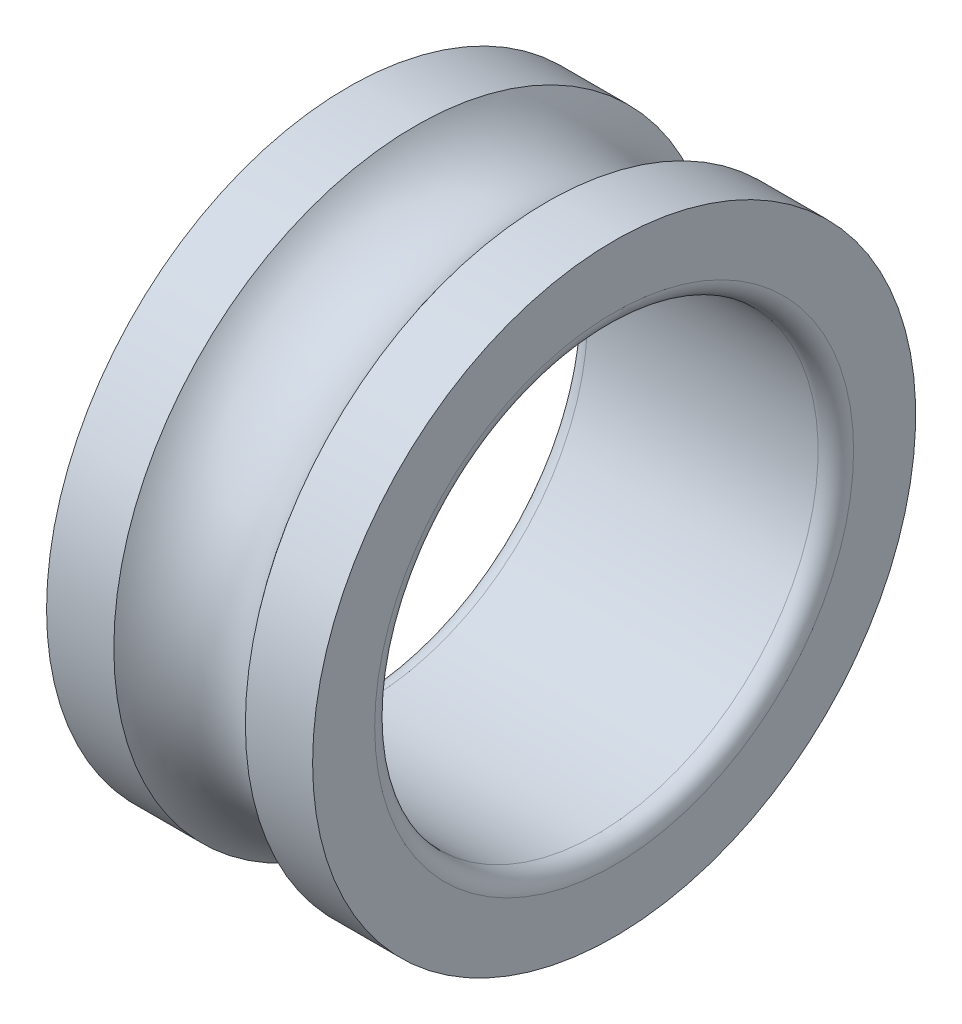
ISO-10303-21;
HEADER;
FILE_DESCRIPTION(('STEP AP214'),'2;1');
FILE_NAME('part.step','',(''),(''),'','','');
FILE_SCHEMA(('AUTOMOTIVE_DESIGN { 1 0 10303 214 1 1 1 1 }'));
ENDSEC;
DATA;
#1=APPLICATION_CONTEXT('core data for automotive mechanical design processes');
#2=APPLICATION_PROTOCOL_DEFINITION('international standard','automotive_design',2000,#1);
#3=PRODUCT_CONTEXT('',#1,'mechanical');
#4=PRODUCT('Part','Part','',(#3));
#5=PRODUCT_RELATED_PRODUCT_CATEGORY('part','',(#4));
#6=PRODUCT_DEFINITION_FORMATION('','',#4);
#7=PRODUCT_DEFINITION_CONTEXT('part definition',#1,'design');
#8=PRODUCT_DEFINITION('design','',#6,#7);
#9=PRODUCT_DEFINITION_SHAPE('','',#8);
#10=(LENGTH_UNIT() NAMED_UNIT(*) SI_UNIT(.MILLI.,.METRE.));
#11=(NAMED_UNIT(*) PLANE_ANGLE_UNIT() SI_UNIT($,.RADIAN.));
#12=(NAMED_UNIT(*) SI_UNIT($,.STERADIAN.) SOLID_ANGLE_UNIT());
#13=UNCERTAINTY_MEASURE_WITH_UNIT(LENGTH_MEASURE(1.E-05),#10,'distance_accuracy_value','');
#14=(GEOMETRIC_REPRESENTATION_CONTEXT(3) GLOBAL_UNCERTAINTY_ASSIGNED_CONTEXT((#13)) GLOBAL_UNIT_ASSIGNED_CONTEXT((#10,
#11,#12)) REPRESENTATION_CONTEXT('',''));
#15=CARTESIAN_POINT('',(0.,0.,0.));
#16=DIRECTION('',(0.,0.,1.));
#17=DIRECTION('',(1.,0.,0.));
#18=AXIS2_PLACEMENT_3D('',#15,#16,#17);
#19=CARTESIAN_POINT('',(0.,0.,0.));
#20=DIRECTION('',(-1.,0.,0.));
#21=DIRECTION('',(0.,0.,1.));
#22=AXIS2_PLACEMENT_3D('',#19,#20,#21);
#23=CYLINDRICAL_SURFACE('',#22,17.);
#24=CARTESIAN_POINT('',(0.,0.,0.));
#25=DIRECTION('',(-1.,0.,0.));
#26=DIRECTION('',(0.,0.,1.));
#27=AXIS2_PLACEMENT_3D('',#24,#25,#26);
#28=CIRCLE('',#27,17.);
#29=CARTESIAN_POINT('',(0.,0.,17.));
#30=VERTEX_POINT('',#29);
#31=EDGE_CURVE('E10',#30,#30,#28,.T.);
#32=ORIENTED_EDGE('',*,*,#31,.F.);
#33=EDGE_LOOP('',(#32));
#34=FACE_BOUND('',#33,.T.);
#35=CARTESIAN_POINT('',(3.79223787170752,0.,0.));
#36=DIRECTION('',(-1.,0.,0.));
#37=DIRECTION('',(0.,0.,1.));
#38=AXIS2_PLACEMENT_3D('',#35,#36,#37);
#39=CIRCLE('',#38,17.);
#40=CARTESIAN_POINT('',(3.79223787170752,0.,17.));
#41=VERTEX_POINT('',#40);
#42=EDGE_CURVE('E43',#41,#41,#39,.T.);
#43=ORIENTED_EDGE('',*,*,#42,.T.);
#44=EDGE_LOOP('',(#43));
#45=FACE_BOUND('',#44,.T.);
#46=ADVANCED_FACE('F15',(#34,#45),#23,.T.);
#47=CARTESIAN_POINT('',(0.,17.,0.));
#48=DIRECTION('',(1.,0.,0.));
#49=DIRECTION('',(0.,0.,-1.));
#50=AXIS2_PLACEMENT_3D('',#47,#48,#49);
#51=PLANE('',#50);
#52=CARTESIAN_POINT('',(0.,0.,0.));
#53=DIRECTION('',(-1.,0.,0.));
#54=DIRECTION('',(0.,0.,1.));
#55=AXIS2_PLACEMENT_3D('',#52,#53,#54);
#56=CIRCLE('',#55,13.5);
#57=CARTESIAN_POINT('',(0.,0.,13.5));
#58=VERTEX_POINT('',#57);
#59=EDGE_CURVE('E21',#58,#58,#56,.T.);
#60=ORIENTED_EDGE('',*,*,#59,.F.);
#61=EDGE_LOOP('',(#60));
#62=FACE_BOUND('',#61,.T.);
#63=ORIENTED_EDGE('',*,*,#31,.T.);
#64=EDGE_LOOP('',(#63));
#65=FACE_BOUND('',#64,.T.);
#66=ADVANCED_FACE('F61',(#62,#65),#51,.F.);
#67=CARTESIAN_POINT('',(1.,0.,0.));
#68=DIRECTION('',(-1.,0.,0.));
#69=DIRECTION('',(0.,0.,1.));
#70=AXIS2_PLACEMENT_3D('',#67,#68,#69);
#71=TOROIDAL_SURFACE('',#70,13.5,1.);
#72=CARTESIAN_POINT('',(1.,0.,0.));
#73=DIRECTION('',(-1.,0.,0.));
#74=DIRECTION('',(0.,0.,1.));
#75=AXIS2_PLACEMENT_3D('',#72,#73,#74);
#76=CIRCLE('',#75,12.5);
#77=CARTESIAN_POINT('',(1.,0.,12.5));
#78=VERTEX_POINT('',#77);
#79=EDGE_CURVE('E25',#78,#78,#76,.T.);
#80=ORIENTED_EDGE('',*,*,#79,.F.);
#81=EDGE_LOOP('',(#80));
#82=FACE_BOUND('',#81,.T.);
#83=ORIENTED_EDGE('',*,*,#59,.T.);
#84=EDGE_LOOP('',(#83));
#85=FACE_BOUND('',#84,.T.);
#86=ADVANCED_FACE('F66',(#82,#85),#71,.T.);
#87=CARTESIAN_POINT('',(0.,0.,0.));
#88=DIRECTION('',(-1.,0.,0.));
#89=DIRECTION('',(0.,0.,1.));
#90=AXIS2_PLACEMENT_3D('',#87,#88,#89);
#91=CYLINDRICAL_SURFACE('',#90,12.5);
#92=CARTESIAN_POINT('',(14.,0.,0.));
#93=DIRECTION('',(-1.,0.,0.));
#94=DIRECTION('',(0.,0.,1.));
#95=AXIS2_PLACEMENT_3D('',#92,#93,#94);
#96=CIRCLE('',#95,12.5);
#97=CARTESIAN_POINT('',(14.,0.,12.5));
#98=VERTEX_POINT('',#97);
#99=EDGE_CURVE('E29',#98,#98,#96,.T.);
#100=ORIENTED_EDGE('',*,*,#99,.F.);
#101=EDGE_LOOP('',(#100));
#102=FACE_BOUND('',#101,.T.);
#103=ORIENTED_EDGE('',*,*,#79,.T.);
#104=EDGE_LOOP('',(#103));
#105=FACE_BOUND('',#104,.T.);
#106=ADVANCED_FACE('F71',(#102,#105),#91,.F.);
#107=CARTESIAN_POINT('',(14.,0.,0.));
#108=DIRECTION('',(-1.,0.,0.));
#109=DIRECTION('',(0.,0.,1.));
#110=AXIS2_PLACEMENT_3D('',#107,#108,#109);
#111=TOROIDAL_SURFACE('',#110,13.5,1.);
#112=CARTESIAN_POINT('',(15.,0.,0.));
#113=DIRECTION('',(-1.,0.,0.));
#114=DIRECTION('',(0.,0.,1.));
#115=AXIS2_PLACEMENT_3D('',#112,#113,#114);
#116=CIRCLE('',#115,13.5);
#117=CARTESIAN_POINT('',(15.,0.,13.5));
#118=VERTEX_POINT('',#117);
#119=EDGE_CURVE('E34',#118,#118,#116,.T.);
#120=ORIENTED_EDGE('',*,*,#119,.F.);
#121=EDGE_LOOP('',(#120));
#122=FACE_BOUND('',#121,.T.);
#123=ORIENTED_EDGE('',*,*,#99,.T.);
#124=EDGE_LOOP('',(#123));
#125=FACE_BOUND('',#124,.T.);
#126=ADVANCED_FACE('F77',(#122,#125),#111,.T.);
#127=CARTESIAN_POINT('',(15.,13.5,0.));
#128=DIRECTION('',(-1.,0.,0.));
#129=DIRECTION('',(0.,0.,1.));
#130=AXIS2_PLACEMENT_3D('',#127,#128,#129);
#131=PLANE('',#130);
#132=CARTESIAN_POINT('',(15.,0.,0.));
#133=DIRECTION('',(-1.,0.,0.));
#134=DIRECTION('',(0.,0.,1.));
#135=AXIS2_PLACEMENT_3D('',#132,#133,#134);
#136=CIRCLE('',#135,17.);
#137=CARTESIAN_POINT('',(15.,0.,17.));
#138=VERTEX_POINT('',#137);
#139=EDGE_CURVE('E37',#138,#138,#136,.T.);
#140=ORIENTED_EDGE('',*,*,#139,.F.);
#141=EDGE_LOOP('',(#140));
#142=FACE_BOUND('',#141,.T.);
#143=ORIENTED_EDGE('',*,*,#119,.T.);
#144=EDGE_LOOP('',(#143));
#145=FACE_BOUND('',#144,.T.);
#146=ADVANCED_FACE('F57',(#142,#145),#131,.F.);
#147=CARTESIAN_POINT('',(0.,0.,0.));
#148=DIRECTION('',(-1.,0.,0.));
#149=DIRECTION('',(0.,0.,1.));
#150=AXIS2_PLACEMENT_3D('',#147,#148,#149);
#151=CYLINDRICAL_SURFACE('',#150,17.);
#152=CARTESIAN_POINT('',(11.2077621282925,0.,0.));
#153=DIRECTION('',(-1.,0.,0.));
#154=DIRECTION('',(0.,0.,1.));
#155=AXIS2_PLACEMENT_3D('',#152,#153,#154);
#156=CIRCLE('',#155,17.);
#157=CARTESIAN_POINT('',(11.2077621282925,0.,17.));
#158=VERTEX_POINT('',#157);
#159=EDGE_CURVE('E40',#158,#158,#156,.T.);
#160=ORIENTED_EDGE('',*,*,#159,.F.);
#161=EDGE_LOOP('',(#160));
#162=FACE_BOUND('',#161,.T.);
#163=ORIENTED_EDGE('',*,*,#139,.T.);
#164=EDGE_LOOP('',(#163));
#165=FACE_BOUND('',#164,.T.);
#166=ADVANCED_FACE('F50',(#162,#165),#151,.T.);
#167=CARTESIAN_POINT('',(7.5,0.,0.));
#168=DIRECTION('',(-1.,0.,0.));
#169=DIRECTION('',(0.,0.,1.));
#170=AXIS2_PLACEMENT_3D('',#167,#168,#169);
#171=TOROIDAL_SURFACE('',#170,19.55,4.5);
#172=ORIENTED_EDGE('',*,*,#159,.T.);
#173=EDGE_LOOP('',(#172));
#174=FACE_BOUND('',#173,.T.);
#175=ORIENTED_EDGE('',*,*,#42,.F.);
#176=EDGE_LOOP('',(#175));
#177=FACE_BOUND('',#176,.T.);
#178=ADVANCED_FACE('F48',(#174,#177),#171,.F.);
#179=CLOSED_SHELL('',(#46,#66,#86,#106,#126,#146,#166,#178));
#180=MANIFOLD_SOLID_BREP('B1',#179);
#181=ADVANCED_BREP_SHAPE_REPRESENTATION('',(#18,#180),#14);
#182=SHAPE_DEFINITION_REPRESENTATION(#9,#181);
ENDSEC;
END-ISO-10303-21;
